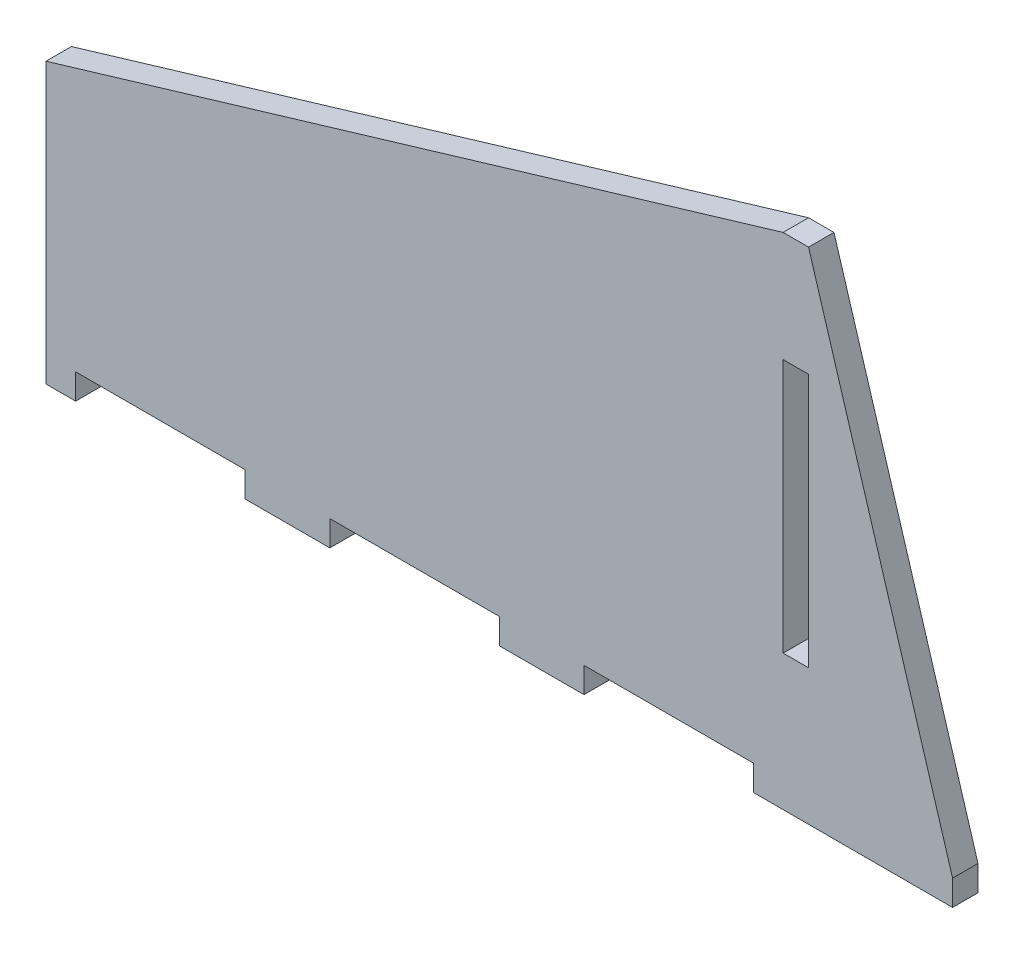
ISO-10303-21;
HEADER;
FILE_DESCRIPTION(('STEP AP214'),'2;1');
FILE_NAME('part.step','',(''),(''),'','','');
FILE_SCHEMA(('AUTOMOTIVE_DESIGN { 1 0 10303 214 1 1 1 1 }'));
ENDSEC;
DATA;
#1=APPLICATION_CONTEXT('core data for automotive mechanical design processes');
#2=APPLICATION_PROTOCOL_DEFINITION('international standard','automotive_design',2000,#1);
#3=PRODUCT_CONTEXT('',#1,'mechanical');
#4=PRODUCT('Part','Part','',(#3));
#5=PRODUCT_RELATED_PRODUCT_CATEGORY('part','',(#4));
#6=PRODUCT_DEFINITION_FORMATION('','',#4);
#7=PRODUCT_DEFINITION_CONTEXT('part definition',#1,'design');
#8=PRODUCT_DEFINITION('design','',#6,#7);
#9=PRODUCT_DEFINITION_SHAPE('','',#8);
#10=(LENGTH_UNIT() NAMED_UNIT(*) SI_UNIT(.MILLI.,.METRE.));
#11=(NAMED_UNIT(*) PLANE_ANGLE_UNIT() SI_UNIT($,.RADIAN.));
#12=(NAMED_UNIT(*) SI_UNIT($,.STERADIAN.) SOLID_ANGLE_UNIT());
#13=UNCERTAINTY_MEASURE_WITH_UNIT(LENGTH_MEASURE(1.E-05),#10,'distance_accuracy_value','');
#14=(GEOMETRIC_REPRESENTATION_CONTEXT(3) GLOBAL_UNCERTAINTY_ASSIGNED_CONTEXT((#13)) GLOBAL_UNIT_ASSIGNED_CONTEXT((#10,
#11,#12)) REPRESENTATION_CONTEXT('',''));
#15=CARTESIAN_POINT('',(0.,0.,0.));
#16=DIRECTION('',(0.,0.,1.));
#17=DIRECTION('',(1.,0.,0.));
#18=AXIS2_PLACEMENT_3D('',#15,#16,#17);
#19=CARTESIAN_POINT('',(0.,0.,3.));
#20=DIRECTION('',(0.,0.,-1.));
#21=DIRECTION('',(-1.,0.,0.));
#22=AXIS2_PLACEMENT_3D('',#19,#20,#21);
#23=PLANE('',#22);
#24=DIRECTION('',(0.,-1.,0.));
#25=VECTOR('',#24,1.);
#26=CARTESIAN_POINT('',(-90.,33.,3.));
#27=LINE('',#26,#25);
#28=CARTESIAN_POINT('',(-90.,33.,3.));
#29=VERTEX_POINT('',#28);
#30=CARTESIAN_POINT('',(-90.,0.,3.));
#31=VERTEX_POINT('',#30);
#32=EDGE_CURVE('E218',#29,#31,#27,.T.);
#33=ORIENTED_EDGE('',*,*,#32,.T.);
#34=DIRECTION('',(1.,-1.16063243671944E-11,0.));
#35=VECTOR('',#34,1.);
#36=CARTESIAN_POINT('',(-90.,0.,3.));
#37=LINE('',#36,#35);
#38=CARTESIAN_POINT('',(-86.5,-4.06256047321326E-11,3.));
#39=VERTEX_POINT('',#38);
#40=EDGE_CURVE('E221',#31,#39,#37,.T.);
#41=ORIENTED_EDGE('',*,*,#40,.T.);
#42=DIRECTION('',(0.,1.,0.));
#43=VECTOR('',#42,1.);
#44=CARTESIAN_POINT('',(-86.5,2.99999999995937,3.));
#45=LINE('',#44,#43);
#46=CARTESIAN_POINT('',(-86.5,2.99999999995937,3.));
#47=VERTEX_POINT('',#46);
#48=EDGE_CURVE('E224',#39,#47,#45,.T.);
#49=ORIENTED_EDGE('',*,*,#48,.T.);
#50=DIRECTION('',(1.,0.,0.));
#51=VECTOR('',#50,1.);
#52=CARTESIAN_POINT('',(-66.5,2.99999999995942,3.));
#53=LINE('',#52,#51);
#54=CARTESIAN_POINT('',(-66.5,2.99999999995942,3.));
#55=VERTEX_POINT('',#54);
#56=EDGE_CURVE('E226',#47,#55,#53,.T.);
#57=ORIENTED_EDGE('',*,*,#56,.T.);
#58=DIRECTION('',(0.,-1.,0.));
#59=VECTOR('',#58,1.);
#60=CARTESIAN_POINT('',(-66.5,2.99999999995942,3.));
#61=LINE('',#60,#59);
#62=CARTESIAN_POINT('',(-66.5,0.,3.));
#63=VERTEX_POINT('',#62);
#64=EDGE_CURVE('E228',#55,#63,#61,.T.);
#65=ORIENTED_EDGE('',*,*,#64,.T.);
#66=DIRECTION('',(1.,0.,0.));
#67=VECTOR('',#66,1.);
#68=CARTESIAN_POINT('',(-66.5,0.,3.));
#69=LINE('',#68,#67);
#70=CARTESIAN_POINT('',(-56.5,0.,3.));
#71=VERTEX_POINT('',#70);
#72=EDGE_CURVE('E230',#63,#71,#69,.T.);
#73=ORIENTED_EDGE('',*,*,#72,.T.);
#74=DIRECTION('',(0.,1.,0.));
#75=VECTOR('',#74,1.);
#76=CARTESIAN_POINT('',(-56.5,0.,3.));
#77=LINE('',#76,#75);
#78=CARTESIAN_POINT('',(-56.5,2.99999999995942,3.));
#79=VERTEX_POINT('',#78);
#80=EDGE_CURVE('E232',#71,#79,#77,.T.);
#81=ORIENTED_EDGE('',*,*,#80,.T.);
#82=DIRECTION('',(1.,0.,0.));
#83=VECTOR('',#82,1.);
#84=CARTESIAN_POINT('',(-56.5,2.99999999995942,3.));
#85=LINE('',#84,#83);
#86=CARTESIAN_POINT('',(-36.5,2.99999999995942,3.));
#87=VERTEX_POINT('',#86);
#88=EDGE_CURVE('E234',#79,#87,#85,.T.);
#89=ORIENTED_EDGE('',*,*,#88,.T.);
#90=DIRECTION('',(0.,-1.,0.));
#91=VECTOR('',#90,1.);
#92=CARTESIAN_POINT('',(-36.5,2.99999999995942,3.));
#93=LINE('',#92,#91);
#94=CARTESIAN_POINT('',(-36.5,0.,3.));
#95=VERTEX_POINT('',#94);
#96=EDGE_CURVE('E236',#87,#95,#93,.T.);
#97=ORIENTED_EDGE('',*,*,#96,.T.);
#98=DIRECTION('',(1.,0.,0.));
#99=VECTOR('',#98,1.);
#100=CARTESIAN_POINT('',(-36.5,0.,3.));
#101=LINE('',#100,#99);
#102=CARTESIAN_POINT('',(-26.5,0.,3.));
#103=VERTEX_POINT('',#102);
#104=EDGE_CURVE('E238',#95,#103,#101,.T.);
#105=ORIENTED_EDGE('',*,*,#104,.T.);
#106=DIRECTION('',(0.,1.,0.));
#107=VECTOR('',#106,1.);
#108=CARTESIAN_POINT('',(-26.5,0.,3.));
#109=LINE('',#108,#107);
#110=CARTESIAN_POINT('',(-26.5,2.99999999995942,3.));
#111=VERTEX_POINT('',#110);
#112=EDGE_CURVE('E240',#103,#111,#109,.T.);
#113=ORIENTED_EDGE('',*,*,#112,.T.);
#114=DIRECTION('',(1.,0.,0.));
#115=VECTOR('',#114,1.);
#116=CARTESIAN_POINT('',(-6.49999999999997,2.99999999995956,3.));
#117=LINE('',#116,#115);
#118=CARTESIAN_POINT('',(-6.49999999999997,2.99999999995956,3.));
#119=VERTEX_POINT('',#118);
#120=EDGE_CURVE('E242',#111,#119,#117,.T.);
#121=ORIENTED_EDGE('',*,*,#120,.T.);
#122=DIRECTION('',(0.,-1.,0.));
#123=VECTOR('',#122,1.);
#124=CARTESIAN_POINT('',(-6.49999999999996,-4.04405675613617E-11,3.));
#125=LINE('',#124,#123);
#126=CARTESIAN_POINT('',(-6.49999999999996,-4.04405675613617E-11,3.));
#127=VERTEX_POINT('',#126);
#128=EDGE_CURVE('E244',#119,#127,#125,.T.);
#129=ORIENTED_EDGE('',*,*,#128,.T.);
#130=DIRECTION('',(1.,1.7208752153771E-12,0.));
#131=VECTOR('',#130,1.);
#132=CARTESIAN_POINT('',(-6.49999999999996,-4.04405675613617E-11,3.));
#133=LINE('',#132,#131);
#134=CARTESIAN_POINT('',(17.,0.,3.));
#135=VERTEX_POINT('',#134);
#136=EDGE_CURVE('E246',#127,#135,#133,.T.);
#137=ORIENTED_EDGE('',*,*,#136,.T.);
#138=DIRECTION('',(0.,1.,0.));
#139=VECTOR('',#138,1.);
#140=CARTESIAN_POINT('',(17.,0.,3.));
#141=LINE('',#140,#139);
#142=CARTESIAN_POINT('',(17.,3.,3.));
#143=VERTEX_POINT('',#142);
#144=EDGE_CURVE('E248',#135,#143,#141,.T.);
#145=ORIENTED_EDGE('',*,*,#144,.T.);
#146=DIRECTION('',(-0.290481603623537,0.956880576642821,0.));
#147=VECTOR('',#146,1.);
#148=CARTESIAN_POINT('',(17.,3.,3.));
#149=LINE('',#148,#147);
#150=CARTESIAN_POINT('',(0.,59.000000000034,3.));
#151=VERTEX_POINT('',#150);
#152=EDGE_CURVE('E250',#143,#151,#149,.T.);
#153=ORIENTED_EDGE('',*,*,#152,.T.);
#154=DIRECTION('',(-1.,0.,0.));
#155=VECTOR('',#154,1.);
#156=CARTESIAN_POINT('',(0.,59.000000000034,3.));
#157=LINE('',#156,#155);
#158=CARTESIAN_POINT('',(-3.,59.000000000034,3.));
#159=VERTEX_POINT('',#158);
#160=EDGE_CURVE('E252',#151,#159,#157,.T.);
#161=ORIENTED_EDGE('',*,*,#160,.T.);
#162=DIRECTION('',(-0.958128861743707,-0.286337360981252,0.));
#163=VECTOR('',#162,1.);
#164=CARTESIAN_POINT('',(-3.,59.000000000034,3.));
#165=LINE('',#164,#163);
#166=EDGE_CURVE('E254',#159,#29,#165,.T.);
#167=ORIENTED_EDGE('',*,*,#166,.T.);
#168=EDGE_LOOP('',(#33,#41,#49,#57,#65,#73,#81,#89,#97,#105,#113,#121,#129,#137,#145,#153,#161,#167));
#169=FACE_BOUND('',#168,.T.);
#170=DIRECTION('',(-1.,0.,0.));
#171=VECTOR('',#170,1.);
#172=CARTESIAN_POINT('',(0.,45.9999999999955,3.));
#173=LINE('',#172,#171);
#174=CARTESIAN_POINT('',(0.,45.9999999999955,3.));
#175=VERTEX_POINT('',#174);
#176=CARTESIAN_POINT('',(-3.,45.9999999999955,3.));
#177=VERTEX_POINT('',#176);
#178=EDGE_CURVE('E182',#175,#177,#173,.T.);
#179=ORIENTED_EDGE('',*,*,#178,.F.);
#180=DIRECTION('',(0.,1.,0.));
#181=VECTOR('',#180,1.);
#182=CARTESIAN_POINT('',(0.,15.9999999999955,3.));
#183=LINE('',#182,#181);
#184=CARTESIAN_POINT('',(0.,15.9999999999955,3.));
#185=VERTEX_POINT('',#184);
#186=EDGE_CURVE('E204',#185,#175,#183,.T.);
#187=ORIENTED_EDGE('',*,*,#186,.F.);
#188=DIRECTION('',(1.,0.,0.));
#189=VECTOR('',#188,1.);
#190=CARTESIAN_POINT('',(-3.,15.9999999999955,3.));
#191=LINE('',#190,#189);
#192=CARTESIAN_POINT('',(-3.,15.9999999999955,3.));
#193=VERTEX_POINT('',#192);
#194=EDGE_CURVE('E202',#193,#185,#191,.T.);
#195=ORIENTED_EDGE('',*,*,#194,.F.);
#196=DIRECTION('',(0.,-1.,0.));
#197=VECTOR('',#196,1.);
#198=CARTESIAN_POINT('',(-3.,45.9999999999955,3.));
#199=LINE('',#198,#197);
#200=EDGE_CURVE('E190',#177,#193,#199,.T.);
#201=ORIENTED_EDGE('',*,*,#200,.F.);
#202=EDGE_LOOP('',(#179,#187,#195,#201));
#203=FACE_BOUND('',#202,.T.);
#204=ADVANCED_FACE('F33',(#169,#203),#23,.F.);
#205=CARTESIAN_POINT('',(0.,0.,0.));
#206=DIRECTION('',(0.,0.,-1.));
#207=DIRECTION('',(-1.,0.,0.));
#208=AXIS2_PLACEMENT_3D('',#205,#206,#207);
#209=PLANE('',#208);
#210=DIRECTION('',(0.,-1.,0.));
#211=VECTOR('',#210,1.);
#212=CARTESIAN_POINT('',(-90.,33.,0.));
#213=LINE('',#212,#211);
#214=CARTESIAN_POINT('',(-90.,33.,0.));
#215=VERTEX_POINT('',#214);
#216=CARTESIAN_POINT('',(-90.,0.,0.));
#217=VERTEX_POINT('',#216);
#218=EDGE_CURVE('E198',#215,#217,#213,.T.);
#219=ORIENTED_EDGE('',*,*,#218,.F.);
#220=DIRECTION('',(-0.958128861743707,-0.286337360981252,0.));
#221=VECTOR('',#220,1.);
#222=CARTESIAN_POINT('',(-3.,59.000000000034,0.));
#223=LINE('',#222,#221);
#224=CARTESIAN_POINT('',(-3.,59.000000000034,0.));
#225=VERTEX_POINT('',#224);
#226=EDGE_CURVE('E222',#225,#215,#223,.T.);
#227=ORIENTED_EDGE('',*,*,#226,.F.);
#228=DIRECTION('',(-1.,0.,0.));
#229=VECTOR('',#228,1.);
#230=CARTESIAN_POINT('',(0.,59.000000000034,0.));
#231=LINE('',#230,#229);
#232=CARTESIAN_POINT('',(0.,59.000000000034,0.));
#233=VERTEX_POINT('',#232);
#234=EDGE_CURVE('E289',#233,#225,#231,.T.);
#235=ORIENTED_EDGE('',*,*,#234,.F.);
#236=DIRECTION('',(-0.290481603623537,0.956880576642821,0.));
#237=VECTOR('',#236,1.);
#238=CARTESIAN_POINT('',(17.,3.,0.));
#239=LINE('',#238,#237);
#240=CARTESIAN_POINT('',(17.,3.,0.));
#241=VERTEX_POINT('',#240);
#242=EDGE_CURVE('E287',#241,#233,#239,.T.);
#243=ORIENTED_EDGE('',*,*,#242,.F.);
#244=DIRECTION('',(0.,1.,0.));
#245=VECTOR('',#244,1.);
#246=CARTESIAN_POINT('',(17.,0.,0.));
#247=LINE('',#246,#245);
#248=CARTESIAN_POINT('',(17.,0.,0.));
#249=VERTEX_POINT('',#248);
#250=EDGE_CURVE('E285',#249,#241,#247,.T.);
#251=ORIENTED_EDGE('',*,*,#250,.F.);
#252=DIRECTION('',(1.,1.7208752153771E-12,0.));
#253=VECTOR('',#252,1.);
#254=CARTESIAN_POINT('',(-6.49999999999996,-4.04405675613617E-11,0.));
#255=LINE('',#254,#253);
#256=CARTESIAN_POINT('',(-6.49999999999996,-4.04405675613617E-11,0.));
#257=VERTEX_POINT('',#256);
#258=EDGE_CURVE('E283',#257,#249,#255,.T.);
#259=ORIENTED_EDGE('',*,*,#258,.F.);
#260=DIRECTION('',(0.,-1.,0.));
#261=VECTOR('',#260,1.);
#262=CARTESIAN_POINT('',(-6.49999999999996,-4.04405675613617E-11,0.));
#263=LINE('',#262,#261);
#264=CARTESIAN_POINT('',(-6.49999999999997,2.99999999995956,0.));
#265=VERTEX_POINT('',#264);
#266=EDGE_CURVE('E281',#265,#257,#263,.T.);
#267=ORIENTED_EDGE('',*,*,#266,.F.);
#268=DIRECTION('',(1.,0.,0.));
#269=VECTOR('',#268,1.);
#270=CARTESIAN_POINT('',(-6.49999999999997,2.99999999995956,0.));
#271=LINE('',#270,#269);
#272=CARTESIAN_POINT('',(-26.5,2.99999999995942,0.));
#273=VERTEX_POINT('',#272);
#274=EDGE_CURVE('E279',#273,#265,#271,.T.);
#275=ORIENTED_EDGE('',*,*,#274,.F.);
#276=DIRECTION('',(0.,1.,0.));
#277=VECTOR('',#276,1.);
#278=CARTESIAN_POINT('',(-26.5,0.,0.));
#279=LINE('',#278,#277);
#280=CARTESIAN_POINT('',(-26.5,0.,0.));
#281=VERTEX_POINT('',#280);
#282=EDGE_CURVE('E277',#281,#273,#279,.T.);
#283=ORIENTED_EDGE('',*,*,#282,.F.);
#284=DIRECTION('',(1.,0.,0.));
#285=VECTOR('',#284,1.);
#286=CARTESIAN_POINT('',(-36.5,0.,0.));
#287=LINE('',#286,#285);
#288=CARTESIAN_POINT('',(-36.5,0.,0.));
#289=VERTEX_POINT('',#288);
#290=EDGE_CURVE('E275',#289,#281,#287,.T.);
#291=ORIENTED_EDGE('',*,*,#290,.F.);
#292=DIRECTION('',(0.,-1.,0.));
#293=VECTOR('',#292,1.);
#294=CARTESIAN_POINT('',(-36.5,2.99999999995942,0.));
#295=LINE('',#294,#293);
#296=CARTESIAN_POINT('',(-36.5,2.99999999995942,0.));
#297=VERTEX_POINT('',#296);
#298=EDGE_CURVE('E273',#297,#289,#295,.T.);
#299=ORIENTED_EDGE('',*,*,#298,.F.);
#300=DIRECTION('',(1.,0.,0.));
#301=VECTOR('',#300,1.);
#302=CARTESIAN_POINT('',(-56.5,2.99999999995942,0.));
#303=LINE('',#302,#301);
#304=CARTESIAN_POINT('',(-56.5,2.99999999995942,0.));
#305=VERTEX_POINT('',#304);
#306=EDGE_CURVE('E271',#305,#297,#303,.T.);
#307=ORIENTED_EDGE('',*,*,#306,.F.);
#308=DIRECTION('',(0.,1.,0.));
#309=VECTOR('',#308,1.);
#310=CARTESIAN_POINT('',(-56.5,0.,0.));
#311=LINE('',#310,#309);
#312=CARTESIAN_POINT('',(-56.5,0.,0.));
#313=VERTEX_POINT('',#312);
#314=EDGE_CURVE('E269',#313,#305,#311,.T.);
#315=ORIENTED_EDGE('',*,*,#314,.F.);
#316=DIRECTION('',(1.,0.,0.));
#317=VECTOR('',#316,1.);
#318=CARTESIAN_POINT('',(-66.5,0.,0.));
#319=LINE('',#318,#317);
#320=CARTESIAN_POINT('',(-66.5,0.,0.));
#321=VERTEX_POINT('',#320);
#322=EDGE_CURVE('E267',#321,#313,#319,.T.);
#323=ORIENTED_EDGE('',*,*,#322,.F.);
#324=DIRECTION('',(0.,-1.,0.));
#325=VECTOR('',#324,1.);
#326=CARTESIAN_POINT('',(-66.5,2.99999999995942,0.));
#327=LINE('',#326,#325);
#328=CARTESIAN_POINT('',(-66.5,2.99999999995942,0.));
#329=VERTEX_POINT('',#328);
#330=EDGE_CURVE('E265',#329,#321,#327,.T.);
#331=ORIENTED_EDGE('',*,*,#330,.F.);
#332=DIRECTION('',(1.,0.,0.));
#333=VECTOR('',#332,1.);
#334=CARTESIAN_POINT('',(-66.5,2.99999999995942,0.));
#335=LINE('',#334,#333);
#336=CARTESIAN_POINT('',(-86.5,2.99999999995937,0.));
#337=VERTEX_POINT('',#336);
#338=EDGE_CURVE('E263',#337,#329,#335,.T.);
#339=ORIENTED_EDGE('',*,*,#338,.F.);
#340=DIRECTION('',(0.,1.,0.));
#341=VECTOR('',#340,1.);
#342=CARTESIAN_POINT('',(-86.5,2.99999999995937,0.));
#343=LINE('',#342,#341);
#344=CARTESIAN_POINT('',(-86.5,-4.06256047321326E-11,0.));
#345=VERTEX_POINT('',#344);
#346=EDGE_CURVE('E261',#345,#337,#343,.T.);
#347=ORIENTED_EDGE('',*,*,#346,.F.);
#348=DIRECTION('',(1.,-1.16063243671944E-11,0.));
#349=VECTOR('',#348,1.);
#350=CARTESIAN_POINT('',(-90.,0.,0.));
#351=LINE('',#350,#349);
#352=EDGE_CURVE('E259',#217,#345,#351,.T.);
#353=ORIENTED_EDGE('',*,*,#352,.F.);
#354=EDGE_LOOP('',(#219,#227,#235,#243,#251,#259,#267,#275,#283,#291,#299,#307,#315,#323,#331,
#339,#347,#353));
#355=FACE_BOUND('',#354,.T.);
#356=DIRECTION('',(0.,1.,0.));
#357=VECTOR('',#356,1.);
#358=CARTESIAN_POINT('',(0.,15.9999999999955,0.));
#359=LINE('',#358,#357);
#360=CARTESIAN_POINT('',(0.,15.9999999999955,0.));
#361=VERTEX_POINT('',#360);
#362=CARTESIAN_POINT('',(0.,45.9999999999955,0.));
#363=VERTEX_POINT('',#362);
#364=EDGE_CURVE('E191',#361,#363,#359,.T.);
#365=ORIENTED_EDGE('',*,*,#364,.T.);
#366=DIRECTION('',(-1.,0.,0.));
#367=VECTOR('',#366,1.);
#368=CARTESIAN_POINT('',(0.,45.9999999999955,0.));
#369=LINE('',#368,#367);
#370=CARTESIAN_POINT('',(-3.,45.9999999999955,0.));
#371=VERTEX_POINT('',#370);
#372=EDGE_CURVE('E56',#363,#371,#369,.T.);
#373=ORIENTED_EDGE('',*,*,#372,.T.);
#374=DIRECTION('',(0.,-1.,0.));
#375=VECTOR('',#374,1.);
#376=CARTESIAN_POINT('',(-3.,45.9999999999955,0.));
#377=LINE('',#376,#375);
#378=CARTESIAN_POINT('',(-3.,15.9999999999955,0.));
#379=VERTEX_POINT('',#378);
#380=EDGE_CURVE('E197',#371,#379,#377,.T.);
#381=ORIENTED_EDGE('',*,*,#380,.T.);
#382=DIRECTION('',(1.,0.,0.));
#383=VECTOR('',#382,1.);
#384=CARTESIAN_POINT('',(-3.,15.9999999999955,0.));
#385=LINE('',#384,#383);
#386=EDGE_CURVE('E210',#379,#361,#385,.T.);
#387=ORIENTED_EDGE('',*,*,#386,.T.);
#388=EDGE_LOOP('',(#365,#373,#381,#387));
#389=FACE_BOUND('',#388,.T.);
#390=ADVANCED_FACE('F349',(#355,#389),#209,.T.);
#391=CARTESIAN_POINT('',(-90.,33.,3.));
#392=DIRECTION('',(1.,0.,0.));
#393=DIRECTION('',(0.,1.,0.));
#394=AXIS2_PLACEMENT_3D('',#391,#392,#393);
#395=PLANE('',#394);
#396=ORIENTED_EDGE('',*,*,#218,.T.);
#397=DIRECTION('',(0.,0.,-1.));
#398=VECTOR('',#397,1.);
#399=CARTESIAN_POINT('',(-90.,0.,3.));
#400=LINE('',#399,#398);
#401=EDGE_CURVE('E11',#31,#217,#400,.T.);
#402=ORIENTED_EDGE('',*,*,#401,.F.);
#403=ORIENTED_EDGE('',*,*,#32,.F.);
#404=DIRECTION('',(0.,0.,-1.));
#405=VECTOR('',#404,1.);
#406=CARTESIAN_POINT('',(-90.,33.,3.));
#407=LINE('',#406,#405);
#408=EDGE_CURVE('E256',#29,#215,#407,.T.);
#409=ORIENTED_EDGE('',*,*,#408,.T.);
#410=EDGE_LOOP('',(#396,#402,#403,#409));
#411=FACE_BOUND('',#410,.T.);
#412=ADVANCED_FACE('F35',(#411),#395,.F.);
#413=CARTESIAN_POINT('',(-90.,0.,3.));
#414=DIRECTION('',(1.16063243671944E-11,1.,0.));
#415=DIRECTION('',(-1.,1.16063243671944E-11,0.));
#416=AXIS2_PLACEMENT_3D('',#413,#414,#415);
#417=PLANE('',#416);
#418=ORIENTED_EDGE('',*,*,#352,.T.);
#419=DIRECTION('',(0.,0.,-1.));
#420=VECTOR('',#419,1.);
#421=CARTESIAN_POINT('',(-86.5,-4.06256047321326E-11,3.));
#422=LINE('',#421,#420);
#423=EDGE_CURVE('E41',#39,#345,#422,.T.);
#424=ORIENTED_EDGE('',*,*,#423,.F.);
#425=ORIENTED_EDGE('',*,*,#40,.F.);
#426=ORIENTED_EDGE('',*,*,#401,.T.);
#427=EDGE_LOOP('',(#418,#424,#425,#426));
#428=FACE_BOUND('',#427,.T.);
#429=ADVANCED_FACE('F366',(#428),#417,.F.);
#430=CARTESIAN_POINT('',(-86.5,2.99999999995937,3.));
#431=DIRECTION('',(-1.,0.,0.));
#432=DIRECTION('',(0.,0.,1.));
#433=AXIS2_PLACEMENT_3D('',#430,#431,#432);
#434=PLANE('',#433);
#435=ORIENTED_EDGE('',*,*,#346,.T.);
#436=DIRECTION('',(0.,0.,-1.));
#437=VECTOR('',#436,1.);
#438=CARTESIAN_POINT('',(-86.5,2.99999999995937,3.));
#439=LINE('',#438,#437);
#440=EDGE_CURVE('E336',#47,#337,#439,.T.);
#441=ORIENTED_EDGE('',*,*,#440,.F.);
#442=ORIENTED_EDGE('',*,*,#48,.F.);
#443=ORIENTED_EDGE('',*,*,#423,.T.);
#444=EDGE_LOOP('',(#435,#441,#442,#443));
#445=FACE_BOUND('',#444,.T.);
#446=ADVANCED_FACE('F343',(#445),#434,.F.);
#447=CARTESIAN_POINT('',(-66.5,2.99999999995942,3.));
#448=DIRECTION('',(0.,1.,0.));
#449=DIRECTION('',(-1.,0.,0.));
#450=AXIS2_PLACEMENT_3D('',#447,#448,#449);
#451=PLANE('',#450);
#452=ORIENTED_EDGE('',*,*,#338,.T.);
#453=DIRECTION('',(0.,0.,-1.));
#454=VECTOR('',#453,1.);
#455=CARTESIAN_POINT('',(-66.5,2.99999999995942,3.));
#456=LINE('',#455,#454);
#457=EDGE_CURVE('E333',#55,#329,#456,.T.);
#458=ORIENTED_EDGE('',*,*,#457,.F.);
#459=ORIENTED_EDGE('',*,*,#56,.F.);
#460=ORIENTED_EDGE('',*,*,#440,.T.);
#461=EDGE_LOOP('',(#452,#458,#459,#460));
#462=FACE_BOUND('',#461,.T.);
#463=ADVANCED_FACE('F355',(#462),#451,.F.);
#464=CARTESIAN_POINT('',(-66.5,2.99999999995942,3.));
#465=DIRECTION('',(1.,0.,0.));
#466=DIRECTION('',(0.,0.,-1.));
#467=AXIS2_PLACEMENT_3D('',#464,#465,#466);
#468=PLANE('',#467);
#469=ORIENTED_EDGE('',*,*,#330,.T.);
#470=DIRECTION('',(0.,0.,-1.));
#471=VECTOR('',#470,1.);
#472=CARTESIAN_POINT('',(-66.5,0.,3.));
#473=LINE('',#472,#471);
#474=EDGE_CURVE('E330',#63,#321,#473,.T.);
#475=ORIENTED_EDGE('',*,*,#474,.F.);
#476=ORIENTED_EDGE('',*,*,#64,.F.);
#477=ORIENTED_EDGE('',*,*,#457,.T.);
#478=EDGE_LOOP('',(#469,#475,#476,#477));
#479=FACE_BOUND('',#478,.T.);
#480=ADVANCED_FACE('F359',(#479),#468,.F.);
#481=CARTESIAN_POINT('',(-66.5,0.,3.));
#482=DIRECTION('',(0.,1.,0.));
#483=DIRECTION('',(0.,0.,1.));
#484=AXIS2_PLACEMENT_3D('',#481,#482,#483);
#485=PLANE('',#484);
#486=ORIENTED_EDGE('',*,*,#322,.T.);
#487=DIRECTION('',(0.,0.,-1.));
#488=VECTOR('',#487,1.);
#489=CARTESIAN_POINT('',(-56.5,0.,3.));
#490=LINE('',#489,#488);
#491=EDGE_CURVE('E327',#71,#313,#490,.T.);
#492=ORIENTED_EDGE('',*,*,#491,.F.);
#493=ORIENTED_EDGE('',*,*,#72,.F.);
#494=ORIENTED_EDGE('',*,*,#474,.T.);
#495=EDGE_LOOP('',(#486,#492,#493,#494));
#496=FACE_BOUND('',#495,.T.);
#497=ADVANCED_FACE('F429',(#496),#485,.F.);
#498=CARTESIAN_POINT('',(-56.5,0.,3.));
#499=DIRECTION('',(-1.,0.,0.));
#500=DIRECTION('',(0.,0.,1.));
#501=AXIS2_PLACEMENT_3D('',#498,#499,#500);
#502=PLANE('',#501);
#503=ORIENTED_EDGE('',*,*,#314,.T.);
#504=DIRECTION('',(0.,0.,-1.));
#505=VECTOR('',#504,1.);
#506=CARTESIAN_POINT('',(-56.5,2.99999999995942,3.));
#507=LINE('',#506,#505);
#508=EDGE_CURVE('E324',#79,#305,#507,.T.);
#509=ORIENTED_EDGE('',*,*,#508,.F.);
#510=ORIENTED_EDGE('',*,*,#80,.F.);
#511=ORIENTED_EDGE('',*,*,#491,.T.);
#512=EDGE_LOOP('',(#503,#509,#510,#511));
#513=FACE_BOUND('',#512,.T.);
#514=ADVANCED_FACE('F427',(#513),#502,.F.);
#515=CARTESIAN_POINT('',(-56.5,2.99999999995942,3.));
#516=DIRECTION('',(0.,1.,0.));
#517=DIRECTION('',(0.,0.,1.));
#518=AXIS2_PLACEMENT_3D('',#515,#516,#517);
#519=PLANE('',#518);
#520=ORIENTED_EDGE('',*,*,#306,.T.);
#521=DIRECTION('',(0.,0.,-1.));
#522=VECTOR('',#521,1.);
#523=CARTESIAN_POINT('',(-36.5,2.99999999995942,3.));
#524=LINE('',#523,#522);
#525=EDGE_CURVE('E321',#87,#297,#524,.T.);
#526=ORIENTED_EDGE('',*,*,#525,.F.);
#527=ORIENTED_EDGE('',*,*,#88,.F.);
#528=ORIENTED_EDGE('',*,*,#508,.T.);
#529=EDGE_LOOP('',(#520,#526,#527,#528));
#530=FACE_BOUND('',#529,.T.);
#531=ADVANCED_FACE('F423',(#530),#519,.F.);
#532=CARTESIAN_POINT('',(-36.5,2.99999999995942,3.));
#533=DIRECTION('',(1.,0.,0.));
#534=DIRECTION('',(0.,1.,0.));
#535=AXIS2_PLACEMENT_3D('',#532,#533,#534);
#536=PLANE('',#535);
#537=ORIENTED_EDGE('',*,*,#298,.T.);
#538=DIRECTION('',(0.,0.,-1.));
#539=VECTOR('',#538,1.);
#540=CARTESIAN_POINT('',(-36.5,0.,3.));
#541=LINE('',#540,#539);
#542=EDGE_CURVE('E318',#95,#289,#541,.T.);
#543=ORIENTED_EDGE('',*,*,#542,.F.);
#544=ORIENTED_EDGE('',*,*,#96,.F.);
#545=ORIENTED_EDGE('',*,*,#525,.T.);
#546=EDGE_LOOP('',(#537,#543,#544,#545));
#547=FACE_BOUND('',#546,.T.);
#548=ADVANCED_FACE('F418',(#547),#536,.F.);
#549=CARTESIAN_POINT('',(-36.5,0.,3.));
#550=DIRECTION('',(0.,1.,0.));
#551=DIRECTION('',(0.,0.,1.));
#552=AXIS2_PLACEMENT_3D('',#549,#550,#551);
#553=PLANE('',#552);
#554=ORIENTED_EDGE('',*,*,#290,.T.);
#555=DIRECTION('',(0.,0.,-1.));
#556=VECTOR('',#555,1.);
#557=CARTESIAN_POINT('',(-26.5,0.,3.));
#558=LINE('',#557,#556);
#559=EDGE_CURVE('E315',#103,#281,#558,.T.);
#560=ORIENTED_EDGE('',*,*,#559,.F.);
#561=ORIENTED_EDGE('',*,*,#104,.F.);
#562=ORIENTED_EDGE('',*,*,#542,.T.);
#563=EDGE_LOOP('',(#554,#560,#561,#562));
#564=FACE_BOUND('',#563,.T.);
#565=ADVANCED_FACE('F412',(#564),#553,.F.);
#566=CARTESIAN_POINT('',(-26.5,0.,3.));
#567=DIRECTION('',(-1.,0.,0.));
#568=DIRECTION('',(0.,-1.,0.));
#569=AXIS2_PLACEMENT_3D('',#566,#567,#568);
#570=PLANE('',#569);
#571=ORIENTED_EDGE('',*,*,#282,.T.);
#572=DIRECTION('',(0.,0.,-1.));
#573=VECTOR('',#572,1.);
#574=CARTESIAN_POINT('',(-26.5,2.99999999995942,3.));
#575=LINE('',#574,#573);
#576=EDGE_CURVE('E312',#111,#273,#575,.T.);
#577=ORIENTED_EDGE('',*,*,#576,.F.);
#578=ORIENTED_EDGE('',*,*,#112,.F.);
#579=ORIENTED_EDGE('',*,*,#559,.T.);
#580=EDGE_LOOP('',(#571,#577,#578,#579));
#581=FACE_BOUND('',#580,.T.);
#582=ADVANCED_FACE('F408',(#581),#570,.F.);
#583=CARTESIAN_POINT('',(-6.49999999999997,2.99999999995956,3.));
#584=DIRECTION('',(0.,1.,0.));
#585=DIRECTION('',(-1.,0.,0.));
#586=AXIS2_PLACEMENT_3D('',#583,#584,#585);
#587=PLANE('',#586);
#588=ORIENTED_EDGE('',*,*,#274,.T.);
#589=DIRECTION('',(0.,0.,-1.));
#590=VECTOR('',#589,1.);
#591=CARTESIAN_POINT('',(-6.49999999999997,2.99999999995956,3.));
#592=LINE('',#591,#590);
#593=EDGE_CURVE('E309',#119,#265,#592,.T.);
#594=ORIENTED_EDGE('',*,*,#593,.F.);
#595=ORIENTED_EDGE('',*,*,#120,.F.);
#596=ORIENTED_EDGE('',*,*,#576,.T.);
#597=EDGE_LOOP('',(#588,#594,#595,#596));
#598=FACE_BOUND('',#597,.T.);
#599=ADVANCED_FACE('F403',(#598),#587,.F.);
#600=CARTESIAN_POINT('',(-6.49999999999996,-4.04405675613617E-11,3.));
#601=DIRECTION('',(1.,0.,0.));
#602=DIRECTION('',(0.,1.,0.));
#603=AXIS2_PLACEMENT_3D('',#600,#601,#602);
#604=PLANE('',#603);
#605=ORIENTED_EDGE('',*,*,#266,.T.);
#606=DIRECTION('',(0.,0.,-1.));
#607=VECTOR('',#606,1.);
#608=CARTESIAN_POINT('',(-6.49999999999996,-4.04405675613617E-11,3.));
#609=LINE('',#608,#607);
#610=EDGE_CURVE('E306',#127,#257,#609,.T.);
#611=ORIENTED_EDGE('',*,*,#610,.F.);
#612=ORIENTED_EDGE('',*,*,#128,.F.);
#613=ORIENTED_EDGE('',*,*,#593,.T.);
#614=EDGE_LOOP('',(#605,#611,#612,#613));
#615=FACE_BOUND('',#614,.T.);
#616=ADVANCED_FACE('F397',(#615),#604,.F.);
#617=CARTESIAN_POINT('',(-6.49999999999996,-4.04405675613617E-11,3.));
#618=DIRECTION('',(-1.7208752153771E-12,1.,0.));
#619=DIRECTION('',(-1.,-1.7208752153771E-12,0.));
#620=AXIS2_PLACEMENT_3D('',#617,#618,#619);
#621=PLANE('',#620);
#622=ORIENTED_EDGE('',*,*,#258,.T.);
#623=DIRECTION('',(0.,0.,-1.));
#624=VECTOR('',#623,1.);
#625=CARTESIAN_POINT('',(17.,0.,3.));
#626=LINE('',#625,#624);
#627=EDGE_CURVE('E303',#135,#249,#626,.T.);
#628=ORIENTED_EDGE('',*,*,#627,.F.);
#629=ORIENTED_EDGE('',*,*,#136,.F.);
#630=ORIENTED_EDGE('',*,*,#610,.T.);
#631=EDGE_LOOP('',(#622,#628,#629,#630));
#632=FACE_BOUND('',#631,.T.);
#633=ADVANCED_FACE('F393',(#632),#621,.F.);
#634=CARTESIAN_POINT('',(17.,0.,3.));
#635=DIRECTION('',(-1.,0.,0.));
#636=DIRECTION('',(0.,-1.,0.));
#637=AXIS2_PLACEMENT_3D('',#634,#635,#636);
#638=PLANE('',#637);
#639=ORIENTED_EDGE('',*,*,#250,.T.);
#640=DIRECTION('',(0.,0.,-1.));
#641=VECTOR('',#640,1.);
#642=CARTESIAN_POINT('',(17.,3.,3.));
#643=LINE('',#642,#641);
#644=EDGE_CURVE('E300',#143,#241,#643,.T.);
#645=ORIENTED_EDGE('',*,*,#644,.F.);
#646=ORIENTED_EDGE('',*,*,#144,.F.);
#647=ORIENTED_EDGE('',*,*,#627,.T.);
#648=EDGE_LOOP('',(#639,#645,#646,#647));
#649=FACE_BOUND('',#648,.T.);
#650=ADVANCED_FACE('F388',(#649),#638,.F.);
#651=CARTESIAN_POINT('',(17.,3.,3.));
#652=DIRECTION('',(-0.956880576642821,-0.290481603623537,0.));
#653=DIRECTION('',(0.290481603623537,-0.956880576642821,0.));
#654=AXIS2_PLACEMENT_3D('',#651,#652,#653);
#655=PLANE('',#654);
#656=ORIENTED_EDGE('',*,*,#242,.T.);
#657=DIRECTION('',(0.,0.,-1.));
#658=VECTOR('',#657,1.);
#659=CARTESIAN_POINT('',(0.,59.000000000034,3.));
#660=LINE('',#659,#658);
#661=EDGE_CURVE('E297',#151,#233,#660,.T.);
#662=ORIENTED_EDGE('',*,*,#661,.F.);
#663=ORIENTED_EDGE('',*,*,#152,.F.);
#664=ORIENTED_EDGE('',*,*,#644,.T.);
#665=EDGE_LOOP('',(#656,#662,#663,#664));
#666=FACE_BOUND('',#665,.T.);
#667=ADVANCED_FACE('F382',(#666),#655,.F.);
#668=CARTESIAN_POINT('',(0.,59.000000000034,3.));
#669=DIRECTION('',(0.,-1.,0.));
#670=DIRECTION('',(0.,0.,-1.));
#671=AXIS2_PLACEMENT_3D('',#668,#669,#670);
#672=PLANE('',#671);
#673=ORIENTED_EDGE('',*,*,#234,.T.);
#674=DIRECTION('',(0.,0.,-1.));
#675=VECTOR('',#674,1.);
#676=CARTESIAN_POINT('',(-3.,59.000000000034,3.));
#677=LINE('',#676,#675);
#678=EDGE_CURVE('E294',#159,#225,#677,.T.);
#679=ORIENTED_EDGE('',*,*,#678,.F.);
#680=ORIENTED_EDGE('',*,*,#160,.F.);
#681=ORIENTED_EDGE('',*,*,#661,.T.);
#682=EDGE_LOOP('',(#673,#679,#680,#681));
#683=FACE_BOUND('',#682,.T.);
#684=ADVANCED_FACE('F378',(#683),#672,.F.);
#685=CARTESIAN_POINT('',(-3.,59.000000000034,3.));
#686=DIRECTION('',(0.286337360981252,-0.958128861743707,0.));
#687=DIRECTION('',(0.958128861743707,0.286337360981252,0.));
#688=AXIS2_PLACEMENT_3D('',#685,#686,#687);
#689=PLANE('',#688);
#690=ORIENTED_EDGE('',*,*,#226,.T.);
#691=ORIENTED_EDGE('',*,*,#408,.F.);
#692=ORIENTED_EDGE('',*,*,#166,.F.);
#693=ORIENTED_EDGE('',*,*,#678,.T.);
#694=EDGE_LOOP('',(#690,#691,#692,#693));
#695=FACE_BOUND('',#694,.T.);
#696=ADVANCED_FACE('F373',(#695),#689,.F.);
#697=CARTESIAN_POINT('',(0.,45.9999999999955,3.));
#698=DIRECTION('',(0.,-1.,0.));
#699=DIRECTION('',(1.,0.,0.));
#700=AXIS2_PLACEMENT_3D('',#697,#698,#699);
#701=PLANE('',#700);
#702=ORIENTED_EDGE('',*,*,#372,.F.);
#703=DIRECTION('',(0.,0.,-1.));
#704=VECTOR('',#703,1.);
#705=CARTESIAN_POINT('',(0.,45.9999999999955,3.));
#706=LINE('',#705,#704);
#707=EDGE_CURVE('E186',#175,#363,#706,.T.);
#708=ORIENTED_EDGE('',*,*,#707,.F.);
#709=ORIENTED_EDGE('',*,*,#178,.T.);
#710=DIRECTION('',(0.,0.,-1.));
#711=VECTOR('',#710,1.);
#712=CARTESIAN_POINT('',(-3.,45.9999999999955,3.));
#713=LINE('',#712,#711);
#714=EDGE_CURVE('E185',#177,#371,#713,.T.);
#715=ORIENTED_EDGE('',*,*,#714,.T.);
#716=EDGE_LOOP('',(#702,#708,#709,#715));
#717=FACE_BOUND('',#716,.T.);
#718=ADVANCED_FACE('F184',(#717),#701,.T.);
#719=CARTESIAN_POINT('',(-3.,45.9999999999955,3.));
#720=DIRECTION('',(1.,0.,0.));
#721=DIRECTION('',(0.,0.,-1.));
#722=AXIS2_PLACEMENT_3D('',#719,#720,#721);
#723=PLANE('',#722);
#724=ORIENTED_EDGE('',*,*,#380,.F.);
#725=ORIENTED_EDGE('',*,*,#714,.F.);
#726=ORIENTED_EDGE('',*,*,#200,.T.);
#727=DIRECTION('',(0.,0.,-1.));
#728=VECTOR('',#727,1.);
#729=CARTESIAN_POINT('',(-3.,15.9999999999955,3.));
#730=LINE('',#729,#728);
#731=EDGE_CURVE('E199',#193,#379,#730,.T.);
#732=ORIENTED_EDGE('',*,*,#731,.T.);
#733=EDGE_LOOP('',(#724,#725,#726,#732));
#734=FACE_BOUND('',#733,.T.);
#735=ADVANCED_FACE('F194',(#734),#723,.T.);
#736=CARTESIAN_POINT('',(-3.,15.9999999999955,3.));
#737=DIRECTION('',(0.,1.,0.));
#738=DIRECTION('',(0.,0.,1.));
#739=AXIS2_PLACEMENT_3D('',#736,#737,#738);
#740=PLANE('',#739);
#741=ORIENTED_EDGE('',*,*,#386,.F.);
#742=ORIENTED_EDGE('',*,*,#731,.F.);
#743=ORIENTED_EDGE('',*,*,#194,.T.);
#744=DIRECTION('',(0.,0.,-1.));
#745=VECTOR('',#744,1.);
#746=CARTESIAN_POINT('',(0.,15.9999999999955,3.));
#747=LINE('',#746,#745);
#748=EDGE_CURVE('E48',#185,#361,#747,.T.);
#749=ORIENTED_EDGE('',*,*,#748,.T.);
#750=EDGE_LOOP('',(#741,#742,#743,#749));
#751=FACE_BOUND('',#750,.T.);
#752=ADVANCED_FACE('F523',(#751),#740,.T.);
#753=CARTESIAN_POINT('',(0.,15.9999999999955,3.));
#754=DIRECTION('',(-1.,0.,0.));
#755=DIRECTION('',(0.,0.,1.));
#756=AXIS2_PLACEMENT_3D('',#753,#754,#755);
#757=PLANE('',#756);
#758=ORIENTED_EDGE('',*,*,#364,.F.);
#759=ORIENTED_EDGE('',*,*,#748,.F.);
#760=ORIENTED_EDGE('',*,*,#186,.T.);
#761=ORIENTED_EDGE('',*,*,#707,.T.);
#762=EDGE_LOOP('',(#758,#759,#760,#761));
#763=FACE_BOUND('',#762,.T.);
#764=ADVANCED_FACE('F529',(#763),#757,.T.);
#765=CLOSED_SHELL('',(#204,#390,#412,#429,#446,#463,#480,#497,#514,#531,#548,#565,#582,#599,
#616,#633,#650,#667,#684,#696,#718,#735,#752,#764));
#766=MANIFOLD_SOLID_BREP('B2',#765);
#767=ADVANCED_BREP_SHAPE_REPRESENTATION('',(#18,#766),#14);
#768=SHAPE_DEFINITION_REPRESENTATION(#9,#767);
ENDSEC;
END-ISO-10303-21;
